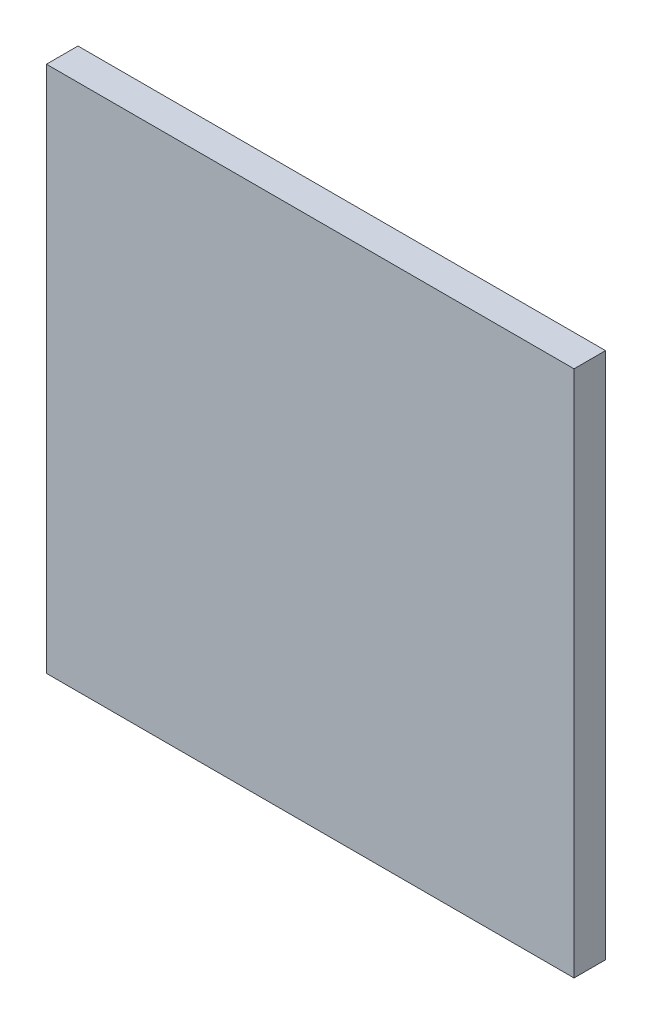
ISO-10303-21;
HEADER;
FILE_DESCRIPTION(('STEP AP214'),'2;1');
FILE_NAME('part.step','',(''),(''),'','','');
FILE_SCHEMA(('AUTOMOTIVE_DESIGN { 1 0 10303 214 1 1 1 1 }'));
ENDSEC;
DATA;
#1=APPLICATION_CONTEXT('core data for automotive mechanical design processes');
#2=APPLICATION_PROTOCOL_DEFINITION('international standard','automotive_design',2000,#1);
#3=PRODUCT_CONTEXT('',#1,'mechanical');
#4=PRODUCT('Part','Part','',(#3));
#5=PRODUCT_RELATED_PRODUCT_CATEGORY('part','',(#4));
#6=PRODUCT_DEFINITION_FORMATION('','',#4);
#7=PRODUCT_DEFINITION_CONTEXT('part definition',#1,'design');
#8=PRODUCT_DEFINITION('design','',#6,#7);
#9=PRODUCT_DEFINITION_SHAPE('','',#8);
#10=(LENGTH_UNIT() NAMED_UNIT(*) SI_UNIT(.MILLI.,.METRE.));
#11=(NAMED_UNIT(*) PLANE_ANGLE_UNIT() SI_UNIT($,.RADIAN.));
#12=(NAMED_UNIT(*) SI_UNIT($,.STERADIAN.) SOLID_ANGLE_UNIT());
#13=UNCERTAINTY_MEASURE_WITH_UNIT(LENGTH_MEASURE(1.E-05),#10,'distance_accuracy_value','');
#14=(GEOMETRIC_REPRESENTATION_CONTEXT(3) GLOBAL_UNCERTAINTY_ASSIGNED_CONTEXT((#13)) GLOBAL_UNIT_ASSIGNED_CONTEXT((#10,
#11,#12)) REPRESENTATION_CONTEXT('',''));
#15=CARTESIAN_POINT('',(0.,0.,0.));
#16=DIRECTION('',(0.,0.,1.));
#17=DIRECTION('',(1.,0.,0.));
#18=AXIS2_PLACEMENT_3D('',#15,#16,#17);
#19=CARTESIAN_POINT('',(0.,0.,0.));
#20=DIRECTION('',(0.,0.,1.));
#21=DIRECTION('',(1.,0.,0.));
#22=AXIS2_PLACEMENT_3D('',#19,#20,#21);
#23=PLANE('',#22);
#24=DIRECTION('',(1.,0.,0.));
#25=VECTOR('',#24,1.);
#26=CARTESIAN_POINT('',(0.837,0.837,0.));
#27=LINE('',#26,#25);
#28=CARTESIAN_POINT('',(0.837,0.837,0.));
#29=VERTEX_POINT('',#28);
#30=CARTESIAN_POINT('',(-0.837,0.837,0.));
#31=VERTEX_POINT('',#30);
#32=EDGE_CURVE('E79',#29,#31,#27,.F.);
#33=ORIENTED_EDGE('',*,*,#32,.F.);
#34=DIRECTION('',(0.,1.,0.));
#35=VECTOR('',#34,1.);
#36=CARTESIAN_POINT('',(0.837,-0.837,0.));
#37=LINE('',#36,#35);
#38=CARTESIAN_POINT('',(0.837,-0.837,0.));
#39=VERTEX_POINT('',#38);
#40=EDGE_CURVE('E55',#39,#29,#37,.T.);
#41=ORIENTED_EDGE('',*,*,#40,.F.);
#42=DIRECTION('',(1.,0.,0.));
#43=VECTOR('',#42,1.);
#44=CARTESIAN_POINT('',(-0.837,-0.837,0.));
#45=LINE('',#44,#43);
#46=CARTESIAN_POINT('',(-0.837,-0.837,0.));
#47=VERTEX_POINT('',#46);
#48=EDGE_CURVE('E57',#47,#39,#45,.T.);
#49=ORIENTED_EDGE('',*,*,#48,.F.);
#50=DIRECTION('',(0.,1.,0.));
#51=VECTOR('',#50,1.);
#52=CARTESIAN_POINT('',(-0.837,0.837,0.));
#53=LINE('',#52,#51);
#54=EDGE_CURVE('E20',#31,#47,#53,.F.);
#55=ORIENTED_EDGE('',*,*,#54,.F.);
#56=EDGE_LOOP('',(#33,#41,#49,#55));
#57=FACE_BOUND('',#56,.T.);
#58=ADVANCED_FACE('F17',(#57),#23,.F.);
#59=CARTESIAN_POINT('',(-0.837,0.837,0.));
#60=DIRECTION('',(-1.,0.,0.));
#61=DIRECTION('',(0.,0.,1.));
#62=AXIS2_PLACEMENT_3D('',#59,#60,#61);
#63=PLANE('',#62);
#64=DIRECTION('',(0.,1.,0.));
#65=VECTOR('',#64,1.);
#66=CARTESIAN_POINT('',(-0.837,0.,0.1));
#67=LINE('',#66,#65);
#68=CARTESIAN_POINT('',(-0.837,0.837,0.1));
#69=VERTEX_POINT('',#68);
#70=CARTESIAN_POINT('',(-0.837,-0.837,0.1));
#71=VERTEX_POINT('',#70);
#72=EDGE_CURVE('E83',#69,#71,#67,.F.);
#73=ORIENTED_EDGE('',*,*,#72,.F.);
#74=DIRECTION('',(0.,0.,1.));
#75=VECTOR('',#74,1.);
#76=CARTESIAN_POINT('',(-0.837,0.837,0.));
#77=LINE('',#76,#75);
#78=EDGE_CURVE('E68',#31,#69,#77,.T.);
#79=ORIENTED_EDGE('',*,*,#78,.F.);
#80=ORIENTED_EDGE('',*,*,#54,.T.);
#81=DIRECTION('',(0.,0.,-1.));
#82=VECTOR('',#81,1.);
#83=CARTESIAN_POINT('',(-0.837,-0.837,0.));
#84=LINE('',#83,#82);
#85=EDGE_CURVE('E63',#71,#47,#84,.T.);
#86=ORIENTED_EDGE('',*,*,#85,.F.);
#87=EDGE_LOOP('',(#73,#79,#80,#86));
#88=FACE_BOUND('',#87,.T.);
#89=ADVANCED_FACE('F65',(#88),#63,.T.);
#90=CARTESIAN_POINT('',(-0.837,-0.837,0.));
#91=DIRECTION('',(0.,-1.,0.));
#92=DIRECTION('',(0.,0.,-1.));
#93=AXIS2_PLACEMENT_3D('',#90,#91,#92);
#94=PLANE('',#93);
#95=DIRECTION('',(1.,0.,0.));
#96=VECTOR('',#95,1.);
#97=CARTESIAN_POINT('',(0.,-0.837,0.1));
#98=LINE('',#97,#96);
#99=CARTESIAN_POINT('',(0.837,-0.837,0.1));
#100=VERTEX_POINT('',#99);
#101=EDGE_CURVE('E72',#71,#100,#98,.T.);
#102=ORIENTED_EDGE('',*,*,#101,.F.);
#103=ORIENTED_EDGE('',*,*,#85,.T.);
#104=ORIENTED_EDGE('',*,*,#48,.T.);
#105=DIRECTION('',(0.,0.,-1.));
#106=VECTOR('',#105,1.);
#107=CARTESIAN_POINT('',(0.837,-0.837,0.));
#108=LINE('',#107,#106);
#109=EDGE_CURVE('E75',#100,#39,#108,.T.);
#110=ORIENTED_EDGE('',*,*,#109,.F.);
#111=EDGE_LOOP('',(#102,#103,#104,#110));
#112=FACE_BOUND('',#111,.T.);
#113=ADVANCED_FACE('F70',(#112),#94,.T.);
#114=CARTESIAN_POINT('',(0.837,-0.837,0.));
#115=DIRECTION('',(1.,0.,0.));
#116=DIRECTION('',(0.,0.,-1.));
#117=AXIS2_PLACEMENT_3D('',#114,#115,#116);
#118=PLANE('',#117);
#119=DIRECTION('',(0.,1.,0.));
#120=VECTOR('',#119,1.);
#121=CARTESIAN_POINT('',(0.837,0.,0.1));
#122=LINE('',#121,#120);
#123=CARTESIAN_POINT('',(0.837,0.837,0.1));
#124=VERTEX_POINT('',#123);
#125=EDGE_CURVE('E26',#100,#124,#122,.T.);
#126=ORIENTED_EDGE('',*,*,#125,.F.);
#127=ORIENTED_EDGE('',*,*,#109,.T.);
#128=ORIENTED_EDGE('',*,*,#40,.T.);
#129=DIRECTION('',(0.,0.,1.));
#130=VECTOR('',#129,1.);
#131=CARTESIAN_POINT('',(0.837,0.837,0.));
#132=LINE('',#131,#130);
#133=EDGE_CURVE('E35',#124,#29,#132,.F.);
#134=ORIENTED_EDGE('',*,*,#133,.F.);
#135=EDGE_LOOP('',(#126,#127,#128,#134));
#136=FACE_BOUND('',#135,.T.);
#137=ADVANCED_FACE('F89',(#136),#118,.T.);
#138=CARTESIAN_POINT('',(0.837,0.837,0.));
#139=DIRECTION('',(0.,1.,0.));
#140=DIRECTION('',(0.,0.,1.));
#141=AXIS2_PLACEMENT_3D('',#138,#139,#140);
#142=PLANE('',#141);
#143=DIRECTION('',(1.,0.,0.));
#144=VECTOR('',#143,1.);
#145=CARTESIAN_POINT('',(0.,0.837,0.1));
#146=LINE('',#145,#144);
#147=EDGE_CURVE('E11',#124,#69,#146,.F.);
#148=ORIENTED_EDGE('',*,*,#147,.F.);
#149=ORIENTED_EDGE('',*,*,#133,.T.);
#150=ORIENTED_EDGE('',*,*,#32,.T.);
#151=ORIENTED_EDGE('',*,*,#78,.T.);
#152=EDGE_LOOP('',(#148,#149,#150,#151));
#153=FACE_BOUND('',#152,.T.);
#154=ADVANCED_FACE('F91',(#153),#142,.T.);
#155=CARTESIAN_POINT('',(0.,0.,0.1));
#156=DIRECTION('',(0.,0.,1.));
#157=DIRECTION('',(1.,0.,0.));
#158=AXIS2_PLACEMENT_3D('',#155,#156,#157);
#159=PLANE('',#158);
#160=ORIENTED_EDGE('',*,*,#125,.T.);
#161=ORIENTED_EDGE('',*,*,#147,.T.);
#162=ORIENTED_EDGE('',*,*,#72,.T.);
#163=ORIENTED_EDGE('',*,*,#101,.T.);
#164=EDGE_LOOP('',(#160,#161,#162,#163));
#165=FACE_BOUND('',#164,.T.);
#166=ADVANCED_FACE('F88',(#165),#159,.T.);
#167=CLOSED_SHELL('',(#58,#89,#113,#137,#154,#166));
#168=MANIFOLD_SOLID_BREP('B1',#167);
#169=ADVANCED_BREP_SHAPE_REPRESENTATION('',(#18,#168),#14);
#170=SHAPE_DEFINITION_REPRESENTATION(#9,#169);
ENDSEC;
END-ISO-10303-21;
